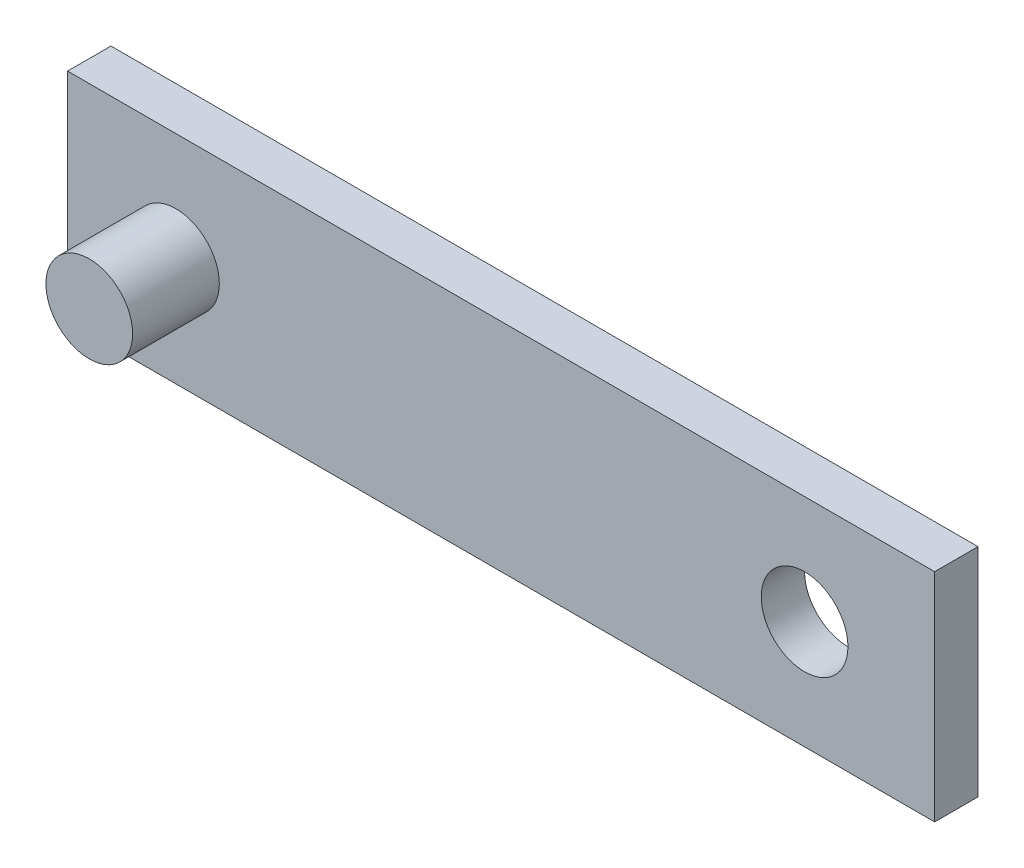
ISO-10303-21;
HEADER;
FILE_DESCRIPTION(('STEP AP214'),'2;1');
FILE_NAME('part.step','',(''),(''),'','','');
FILE_SCHEMA(('AUTOMOTIVE_DESIGN { 1 0 10303 214 1 1 1 1 }'));
ENDSEC;
DATA;
#1=APPLICATION_CONTEXT('core data for automotive mechanical design processes');
#2=APPLICATION_PROTOCOL_DEFINITION('international standard','automotive_design',2000,#1);
#3=PRODUCT_CONTEXT('',#1,'mechanical');
#4=PRODUCT('Part','Part','',(#3));
#5=PRODUCT_RELATED_PRODUCT_CATEGORY('part','',(#4));
#6=PRODUCT_DEFINITION_FORMATION('','',#4);
#7=PRODUCT_DEFINITION_CONTEXT('part definition',#1,'design');
#8=PRODUCT_DEFINITION('design','',#6,#7);
#9=PRODUCT_DEFINITION_SHAPE('','',#8);
#10=(LENGTH_UNIT() NAMED_UNIT(*) SI_UNIT(.MILLI.,.METRE.));
#11=(NAMED_UNIT(*) PLANE_ANGLE_UNIT() SI_UNIT($,.RADIAN.));
#12=(NAMED_UNIT(*) SI_UNIT($,.STERADIAN.) SOLID_ANGLE_UNIT());
#13=UNCERTAINTY_MEASURE_WITH_UNIT(LENGTH_MEASURE(1.E-05),#10,'distance_accuracy_value','');
#14=(GEOMETRIC_REPRESENTATION_CONTEXT(3) GLOBAL_UNCERTAINTY_ASSIGNED_CONTEXT((#13)) GLOBAL_UNIT_ASSIGNED_CONTEXT((#10,
#11,#12)) REPRESENTATION_CONTEXT('',''));
#15=CARTESIAN_POINT('',(0.,0.,0.));
#16=DIRECTION('',(0.,0.,1.));
#17=DIRECTION('',(1.,0.,0.));
#18=AXIS2_PLACEMENT_3D('',#15,#16,#17);
#19=CARTESIAN_POINT('',(0.,0.,5.));
#20=DIRECTION('',(0.,0.,1.));
#21=DIRECTION('',(1.,0.,0.));
#22=AXIS2_PLACEMENT_3D('',#19,#20,#21);
#23=PLANE('',#22);
#24=CARTESIAN_POINT('',(-15.,12.5,5.));
#25=DIRECTION('',(0.,0.,1.));
#26=DIRECTION('',(1.,0.,0.));
#27=AXIS2_PLACEMENT_3D('',#24,#25,#26);
#28=CIRCLE('',#27,5.);
#29=CARTESIAN_POINT('',(-10.,12.5,5.));
#30=VERTEX_POINT('',#29);
#31=EDGE_CURVE('E113',#30,#30,#28,.T.);
#32=ORIENTED_EDGE('',*,*,#31,.F.);
#33=EDGE_LOOP('',(#32));
#34=FACE_BOUND('',#33,.T.);
#35=DIRECTION('',(0.,1.,0.));
#36=VECTOR('',#35,1.);
#37=CARTESIAN_POINT('',(0.,0.,5.));
#38=LINE('',#37,#36);
#39=CARTESIAN_POINT('',(0.,0.,5.));
#40=VERTEX_POINT('',#39);
#41=CARTESIAN_POINT('',(0.,25.,5.));
#42=VERTEX_POINT('',#41);
#43=EDGE_CURVE('E98',#40,#42,#38,.T.);
#44=ORIENTED_EDGE('',*,*,#43,.T.);
#45=DIRECTION('',(-1.,0.,0.));
#46=VECTOR('',#45,1.);
#47=CARTESIAN_POINT('',(0.,25.,5.));
#48=LINE('',#47,#46);
#49=CARTESIAN_POINT('',(-100.,25.,5.));
#50=VERTEX_POINT('',#49);
#51=EDGE_CURVE('E93',#42,#50,#48,.T.);
#52=ORIENTED_EDGE('',*,*,#51,.T.);
#53=DIRECTION('',(0.,-1.,0.));
#54=VECTOR('',#53,1.);
#55=CARTESIAN_POINT('',(-100.,0.,5.));
#56=LINE('',#55,#54);
#57=CARTESIAN_POINT('',(-100.,0.,5.));
#58=VERTEX_POINT('',#57);
#59=EDGE_CURVE('E96',#50,#58,#56,.T.);
#60=ORIENTED_EDGE('',*,*,#59,.T.);
#61=DIRECTION('',(1.,0.,0.));
#62=VECTOR('',#61,1.);
#63=CARTESIAN_POINT('',(0.,0.,5.));
#64=LINE('',#63,#62);
#65=EDGE_CURVE('E63',#58,#40,#64,.T.);
#66=ORIENTED_EDGE('',*,*,#65,.T.);
#67=EDGE_LOOP('',(#44,#52,#60,#66));
#68=FACE_BOUND('',#67,.T.);
#69=CARTESIAN_POINT('',(-87.5,12.5,5.));
#70=DIRECTION('',(0.,0.,1.));
#71=DIRECTION('',(1.,0.,0.));
#72=AXIS2_PLACEMENT_3D('',#69,#70,#71);
#73=CIRCLE('',#72,5.);
#74=CARTESIAN_POINT('',(-82.5,12.5,5.));
#75=VERTEX_POINT('',#74);
#76=EDGE_CURVE('E131',#75,#75,#73,.T.);
#77=ORIENTED_EDGE('',*,*,#76,.F.);
#78=EDGE_LOOP('',(#77));
#79=FACE_BOUND('',#78,.T.);
#80=ADVANCED_FACE('F46',(#34,#68,#79),#23,.T.);
#81=CARTESIAN_POINT('',(0.,0.,0.));
#82=DIRECTION('',(0.,0.,1.));
#83=DIRECTION('',(1.,0.,0.));
#84=AXIS2_PLACEMENT_3D('',#81,#82,#83);
#85=PLANE('',#84);
#86=DIRECTION('',(0.,1.,0.));
#87=VECTOR('',#86,1.);
#88=CARTESIAN_POINT('',(0.,0.,0.));
#89=LINE('',#88,#87);
#90=CARTESIAN_POINT('',(0.,0.,0.));
#91=VERTEX_POINT('',#90);
#92=CARTESIAN_POINT('',(0.,25.,0.));
#93=VERTEX_POINT('',#92);
#94=EDGE_CURVE('E110',#91,#93,#89,.T.);
#95=ORIENTED_EDGE('',*,*,#94,.F.);
#96=DIRECTION('',(1.,0.,0.));
#97=VECTOR('',#96,1.);
#98=CARTESIAN_POINT('',(0.,0.,0.));
#99=LINE('',#98,#97);
#100=CARTESIAN_POINT('',(-100.,0.,0.));
#101=VERTEX_POINT('',#100);
#102=EDGE_CURVE('E86',#101,#91,#99,.T.);
#103=ORIENTED_EDGE('',*,*,#102,.F.);
#104=DIRECTION('',(0.,-1.,0.));
#105=VECTOR('',#104,1.);
#106=CARTESIAN_POINT('',(-100.,0.,0.));
#107=LINE('',#106,#105);
#108=CARTESIAN_POINT('',(-100.,25.,0.));
#109=VERTEX_POINT('',#108);
#110=EDGE_CURVE('E80',#109,#101,#107,.T.);
#111=ORIENTED_EDGE('',*,*,#110,.F.);
#112=DIRECTION('',(-1.,0.,0.));
#113=VECTOR('',#112,1.);
#114=CARTESIAN_POINT('',(0.,25.,0.));
#115=LINE('',#114,#113);
#116=EDGE_CURVE('E102',#93,#109,#115,.T.);
#117=ORIENTED_EDGE('',*,*,#116,.F.);
#118=EDGE_LOOP('',(#95,#103,#111,#117));
#119=FACE_BOUND('',#118,.T.);
#120=CARTESIAN_POINT('',(-15.,12.5,0.));
#121=DIRECTION('',(0.,0.,1.));
#122=DIRECTION('',(1.,0.,0.));
#123=AXIS2_PLACEMENT_3D('',#120,#121,#122);
#124=CIRCLE('',#123,5.);
#125=CARTESIAN_POINT('',(-10.,12.5,0.));
#126=VERTEX_POINT('',#125);
#127=EDGE_CURVE('E125',#126,#126,#124,.T.);
#128=ORIENTED_EDGE('',*,*,#127,.T.);
#129=EDGE_LOOP('',(#128));
#130=FACE_BOUND('',#129,.T.);
#131=ADVANCED_FACE('F121',(#119,#130),#85,.F.);
#132=CARTESIAN_POINT('',(0.,0.,5.));
#133=DIRECTION('',(-1.,0.,0.));
#134=DIRECTION('',(0.,-1.,0.));
#135=AXIS2_PLACEMENT_3D('',#132,#133,#134);
#136=PLANE('',#135);
#137=ORIENTED_EDGE('',*,*,#94,.T.);
#138=DIRECTION('',(0.,0.,-1.));
#139=VECTOR('',#138,1.);
#140=CARTESIAN_POINT('',(0.,25.,5.));
#141=LINE('',#140,#139);
#142=EDGE_CURVE('E13',#42,#93,#141,.T.);
#143=ORIENTED_EDGE('',*,*,#142,.F.);
#144=ORIENTED_EDGE('',*,*,#43,.F.);
#145=DIRECTION('',(0.,0.,-1.));
#146=VECTOR('',#145,1.);
#147=CARTESIAN_POINT('',(0.,0.,5.));
#148=LINE('',#147,#146);
#149=EDGE_CURVE('E106',#40,#91,#148,.T.);
#150=ORIENTED_EDGE('',*,*,#149,.T.);
#151=EDGE_LOOP('',(#137,#143,#144,#150));
#152=FACE_BOUND('',#151,.T.);
#153=ADVANCED_FACE('F48',(#152),#136,.F.);
#154=CARTESIAN_POINT('',(0.,25.,5.));
#155=DIRECTION('',(0.,-1.,0.));
#156=DIRECTION('',(1.,0.,0.));
#157=AXIS2_PLACEMENT_3D('',#154,#155,#156);
#158=PLANE('',#157);
#159=ORIENTED_EDGE('',*,*,#116,.T.);
#160=DIRECTION('',(0.,0.,-1.));
#161=VECTOR('',#160,1.);
#162=CARTESIAN_POINT('',(-100.,25.,5.));
#163=LINE('',#162,#161);
#164=EDGE_CURVE('E55',#50,#109,#163,.T.);
#165=ORIENTED_EDGE('',*,*,#164,.F.);
#166=ORIENTED_EDGE('',*,*,#51,.F.);
#167=ORIENTED_EDGE('',*,*,#142,.T.);
#168=EDGE_LOOP('',(#159,#165,#166,#167));
#169=FACE_BOUND('',#168,.T.);
#170=ADVANCED_FACE('F101',(#169),#158,.F.);
#171=CARTESIAN_POINT('',(-100.,0.,5.));
#172=DIRECTION('',(1.,0.,0.));
#173=DIRECTION('',(0.,0.,-1.));
#174=AXIS2_PLACEMENT_3D('',#171,#172,#173);
#175=PLANE('',#174);
#176=ORIENTED_EDGE('',*,*,#110,.T.);
#177=DIRECTION('',(0.,0.,-1.));
#178=VECTOR('',#177,1.);
#179=CARTESIAN_POINT('',(-100.,0.,5.));
#180=LINE('',#179,#178);
#181=EDGE_CURVE('E103',#58,#101,#180,.T.);
#182=ORIENTED_EDGE('',*,*,#181,.F.);
#183=ORIENTED_EDGE('',*,*,#59,.F.);
#184=ORIENTED_EDGE('',*,*,#164,.T.);
#185=EDGE_LOOP('',(#176,#182,#183,#184));
#186=FACE_BOUND('',#185,.T.);
#187=ADVANCED_FACE('F104',(#186),#175,.F.);
#188=CARTESIAN_POINT('',(0.,0.,5.));
#189=DIRECTION('',(0.,1.,0.));
#190=DIRECTION('',(0.,0.,1.));
#191=AXIS2_PLACEMENT_3D('',#188,#189,#190);
#192=PLANE('',#191);
#193=ORIENTED_EDGE('',*,*,#102,.T.);
#194=ORIENTED_EDGE('',*,*,#149,.F.);
#195=ORIENTED_EDGE('',*,*,#65,.F.);
#196=ORIENTED_EDGE('',*,*,#181,.T.);
#197=EDGE_LOOP('',(#193,#194,#195,#196));
#198=FACE_BOUND('',#197,.T.);
#199=ADVANCED_FACE('F118',(#198),#192,.F.);
#200=CARTESIAN_POINT('',(-15.,12.5,5.));
#201=DIRECTION('',(0.,0.,-1.));
#202=DIRECTION('',(-1.,0.,0.));
#203=AXIS2_PLACEMENT_3D('',#200,#201,#202);
#204=CYLINDRICAL_SURFACE('',#203,5.);
#205=ORIENTED_EDGE('',*,*,#31,.T.);
#206=EDGE_LOOP('',(#205));
#207=FACE_BOUND('',#206,.T.);
#208=ORIENTED_EDGE('',*,*,#127,.F.);
#209=EDGE_LOOP('',(#208));
#210=FACE_BOUND('',#209,.T.);
#211=ADVANCED_FACE('F142',(#207,#210),#204,.F.);
#212=CARTESIAN_POINT('',(-87.5,12.5,15.));
#213=DIRECTION('',(0.,0.,-1.));
#214=DIRECTION('',(-1.,0.,0.));
#215=AXIS2_PLACEMENT_3D('',#212,#213,#214);
#216=CYLINDRICAL_SURFACE('',#215,5.);
#217=CARTESIAN_POINT('',(-87.5,12.5,15.));
#218=DIRECTION('',(0.,0.,1.));
#219=DIRECTION('',(1.,0.,0.));
#220=AXIS2_PLACEMENT_3D('',#217,#218,#219);
#221=CIRCLE('',#220,5.);
#222=CARTESIAN_POINT('',(-82.5,12.5,15.));
#223=VERTEX_POINT('',#222);
#224=EDGE_CURVE('E128',#223,#223,#221,.T.);
#225=ORIENTED_EDGE('',*,*,#224,.F.);
#226=EDGE_LOOP('',(#225));
#227=FACE_BOUND('',#226,.T.);
#228=ORIENTED_EDGE('',*,*,#76,.T.);
#229=EDGE_LOOP('',(#228));
#230=FACE_BOUND('',#229,.T.);
#231=ADVANCED_FACE('F139',(#227,#230),#216,.T.);
#232=CARTESIAN_POINT('',(-87.5,12.5,15.));
#233=DIRECTION('',(0.,0.,1.));
#234=DIRECTION('',(1.,0.,0.));
#235=AXIS2_PLACEMENT_3D('',#232,#233,#234);
#236=PLANE('',#235);
#237=ORIENTED_EDGE('',*,*,#224,.T.);
#238=EDGE_LOOP('',(#237));
#239=FACE_BOUND('',#238,.T.);
#240=ADVANCED_FACE('F137',(#239),#236,.T.);
#241=CLOSED_SHELL('',(#80,#131,#153,#170,#187,#199,#211,#231,#240));
#242=MANIFOLD_SOLID_BREP('B2',#241);
#243=ADVANCED_BREP_SHAPE_REPRESENTATION('',(#18,#242),#14);
#244=SHAPE_DEFINITION_REPRESENTATION(#9,#243);
ENDSEC;
END-ISO-10303-21;
